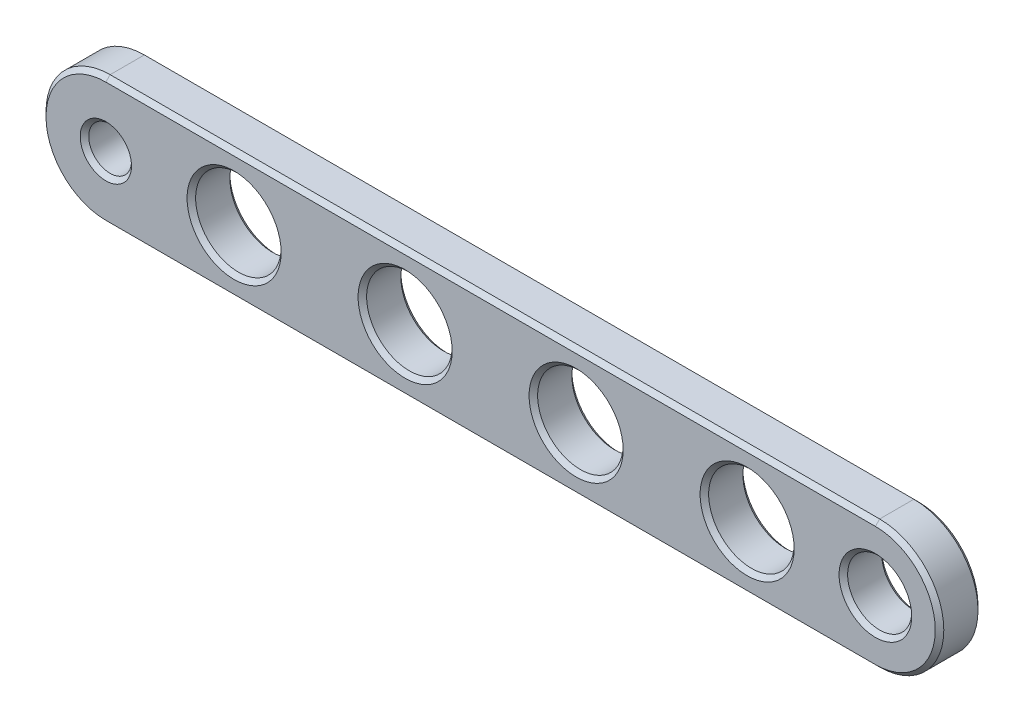
ISO-10303-21;
HEADER;
FILE_DESCRIPTION(('STEP AP214'),'2;1');
FILE_NAME('part.step','',(''),(''),'','','');
FILE_SCHEMA(('AUTOMOTIVE_DESIGN { 1 0 10303 214 1 1 1 1 }'));
ENDSEC;
DATA;
#1=APPLICATION_CONTEXT('core data for automotive mechanical design processes');
#2=APPLICATION_PROTOCOL_DEFINITION('international standard','automotive_design',2000,#1);
#3=PRODUCT_CONTEXT('',#1,'mechanical');
#4=PRODUCT('Part','Part','',(#3));
#5=PRODUCT_RELATED_PRODUCT_CATEGORY('part','',(#4));
#6=PRODUCT_DEFINITION_FORMATION('','',#4);
#7=PRODUCT_DEFINITION_CONTEXT('part definition',#1,'design');
#8=PRODUCT_DEFINITION('design','',#6,#7);
#9=PRODUCT_DEFINITION_SHAPE('','',#8);
#10=(LENGTH_UNIT() NAMED_UNIT(*) SI_UNIT(.MILLI.,.METRE.));
#11=(NAMED_UNIT(*) PLANE_ANGLE_UNIT() SI_UNIT($,.RADIAN.));
#12=(NAMED_UNIT(*) SI_UNIT($,.STERADIAN.) SOLID_ANGLE_UNIT());
#13=UNCERTAINTY_MEASURE_WITH_UNIT(LENGTH_MEASURE(1.E-05),#10,'distance_accuracy_value','');
#14=(GEOMETRIC_REPRESENTATION_CONTEXT(3) GLOBAL_UNCERTAINTY_ASSIGNED_CONTEXT((#13)) GLOBAL_UNIT_ASSIGNED_CONTEXT((#10,
#11,#12)) REPRESENTATION_CONTEXT('',''));
#15=CARTESIAN_POINT('',(0.,0.,0.));
#16=DIRECTION('',(0.,0.,1.));
#17=DIRECTION('',(1.,0.,0.));
#18=AXIS2_PLACEMENT_3D('',#15,#16,#17);
#19=CARTESIAN_POINT('',(-18.,0.,2.));
#20=DIRECTION('',(0.,0.,1.));
#21=DIRECTION('',(1.,0.,0.));
#22=AXIS2_PLACEMENT_3D('',#19,#20,#21);
#23=PLANE('',#22);
#24=CARTESIAN_POINT('',(12.,0.,2.));
#25=DIRECTION('',(0.,0.,1.));
#26=DIRECTION('',(1.,0.,0.));
#27=AXIS2_PLACEMENT_3D('',#24,#25,#26);
#28=CIRCLE('',#27,2.19999999999999);
#29=CARTESIAN_POINT('',(14.2,0.,2.));
#30=VERTEX_POINT('',#29);
#31=EDGE_CURVE('E11',#30,#30,#28,.F.);
#32=ORIENTED_EDGE('',*,*,#31,.T.);
#33=EDGE_LOOP('',(#32));
#34=FACE_BOUND('',#33,.T.);
#35=CARTESIAN_POINT('',(-4.,0.,2.));
#36=DIRECTION('',(0.,0.,1.));
#37=DIRECTION('',(1.,0.,0.));
#38=AXIS2_PLACEMENT_3D('',#35,#36,#37);
#39=CIRCLE('',#38,2.19999999999999);
#40=CARTESIAN_POINT('',(-1.8,0.,2.));
#41=VERTEX_POINT('',#40);
#42=EDGE_CURVE('E45',#41,#41,#39,.F.);
#43=ORIENTED_EDGE('',*,*,#42,.T.);
#44=EDGE_LOOP('',(#43));
#45=FACE_BOUND('',#44,.T.);
#46=CARTESIAN_POINT('',(18.,0.,2.));
#47=DIRECTION('',(0.,0.,1.));
#48=DIRECTION('',(1.,0.,0.));
#49=AXIS2_PLACEMENT_3D('',#46,#47,#48);
#50=CIRCLE('',#49,1.69999999999999);
#51=CARTESIAN_POINT('',(19.7,0.,2.));
#52=VERTEX_POINT('',#51);
#53=EDGE_CURVE('E219',#52,#52,#50,.F.);
#54=ORIENTED_EDGE('',*,*,#53,.T.);
#55=EDGE_LOOP('',(#54));
#56=FACE_BOUND('',#55,.T.);
#57=CARTESIAN_POINT('',(18.,0.,2.));
#58=DIRECTION('',(0.,0.,1.));
#59=DIRECTION('',(1.,0.,0.));
#60=AXIS2_PLACEMENT_3D('',#57,#58,#59);
#61=CIRCLE('',#60,2.8);
#62=CARTESIAN_POINT('',(18.,-2.8,2.));
#63=VERTEX_POINT('',#62);
#64=CARTESIAN_POINT('',(18.,2.8,2.));
#65=VERTEX_POINT('',#64);
#66=EDGE_CURVE('E53',#63,#65,#61,.T.);
#67=ORIENTED_EDGE('',*,*,#66,.T.);
#68=DIRECTION('',(-1.,0.,0.));
#69=VECTOR('',#68,1.);
#70=CARTESIAN_POINT('',(-18.,2.8,2.));
#71=LINE('',#70,#69);
#72=CARTESIAN_POINT('',(-18.,2.8,2.));
#73=VERTEX_POINT('',#72);
#74=EDGE_CURVE('E217',#65,#73,#71,.T.);
#75=ORIENTED_EDGE('',*,*,#74,.T.);
#76=CARTESIAN_POINT('',(-18.,0.,2.));
#77=DIRECTION('',(0.,0.,1.));
#78=DIRECTION('',(1.,0.,0.));
#79=AXIS2_PLACEMENT_3D('',#76,#77,#78);
#80=CIRCLE('',#79,2.8);
#81=CARTESIAN_POINT('',(-18.,-2.8,2.));
#82=VERTEX_POINT('',#81);
#83=EDGE_CURVE('E213',#73,#82,#80,.T.);
#84=ORIENTED_EDGE('',*,*,#83,.T.);
#85=DIRECTION('',(1.,0.,0.));
#86=VECTOR('',#85,1.);
#87=CARTESIAN_POINT('',(18.,-2.8,2.));
#88=LINE('',#87,#86);
#89=EDGE_CURVE('E58',#82,#63,#88,.T.);
#90=ORIENTED_EDGE('',*,*,#89,.T.);
#91=EDGE_LOOP('',(#67,#75,#84,#90));
#92=FACE_BOUND('',#91,.T.);
#93=CARTESIAN_POINT('',(-18.,0.,2.));
#94=DIRECTION('',(0.,0.,1.));
#95=DIRECTION('',(1.,0.,0.));
#96=AXIS2_PLACEMENT_3D('',#93,#94,#95);
#97=CIRCLE('',#96,1.2);
#98=CARTESIAN_POINT('',(-16.8,0.,2.));
#99=VERTEX_POINT('',#98);
#100=EDGE_CURVE('E210',#99,#99,#97,.F.);
#101=ORIENTED_EDGE('',*,*,#100,.T.);
#102=EDGE_LOOP('',(#101));
#103=FACE_BOUND('',#102,.T.);
#104=CARTESIAN_POINT('',(-12.,0.,2.));
#105=DIRECTION('',(0.,0.,1.));
#106=DIRECTION('',(1.,0.,0.));
#107=AXIS2_PLACEMENT_3D('',#104,#105,#106);
#108=CIRCLE('',#107,2.19999999999999);
#109=CARTESIAN_POINT('',(-9.8,0.,2.));
#110=VERTEX_POINT('',#109);
#111=EDGE_CURVE('E207',#110,#110,#108,.F.);
#112=ORIENTED_EDGE('',*,*,#111,.T.);
#113=EDGE_LOOP('',(#112));
#114=FACE_BOUND('',#113,.T.);
#115=CARTESIAN_POINT('',(4.,0.,2.));
#116=DIRECTION('',(0.,0.,1.));
#117=DIRECTION('',(1.,0.,0.));
#118=AXIS2_PLACEMENT_3D('',#115,#116,#117);
#119=CIRCLE('',#118,2.19999999999999);
#120=CARTESIAN_POINT('',(6.2,0.,2.));
#121=VERTEX_POINT('',#120);
#122=EDGE_CURVE('E204',#121,#121,#119,.F.);
#123=ORIENTED_EDGE('',*,*,#122,.T.);
#124=EDGE_LOOP('',(#123));
#125=FACE_BOUND('',#124,.T.);
#126=ADVANCED_FACE('F35',(#34,#45,#56,#92,#103,#114,#125),#23,.T.);
#127=CARTESIAN_POINT('',(-18.,0.,0.));
#128=DIRECTION('',(0.,0.,1.));
#129=DIRECTION('',(1.,0.,0.));
#130=AXIS2_PLACEMENT_3D('',#127,#128,#129);
#131=PLANE('',#130);
#132=CARTESIAN_POINT('',(12.,0.,0.));
#133=DIRECTION('',(0.,0.,1.));
#134=DIRECTION('',(1.,0.,0.));
#135=AXIS2_PLACEMENT_3D('',#132,#133,#134);
#136=CIRCLE('',#135,2.2);
#137=CARTESIAN_POINT('',(14.2,0.,0.));
#138=VERTEX_POINT('',#137);
#139=EDGE_CURVE('E149',#138,#138,#136,.T.);
#140=ORIENTED_EDGE('',*,*,#139,.T.);
#141=EDGE_LOOP('',(#140));
#142=FACE_BOUND('',#141,.T.);
#143=CARTESIAN_POINT('',(4.,0.,0.));
#144=DIRECTION('',(0.,0.,1.));
#145=DIRECTION('',(1.,0.,0.));
#146=AXIS2_PLACEMENT_3D('',#143,#144,#145);
#147=CIRCLE('',#146,2.2);
#148=CARTESIAN_POINT('',(6.2,0.,0.));
#149=VERTEX_POINT('',#148);
#150=EDGE_CURVE('E146',#149,#149,#147,.T.);
#151=ORIENTED_EDGE('',*,*,#150,.T.);
#152=EDGE_LOOP('',(#151));
#153=FACE_BOUND('',#152,.T.);
#154=CARTESIAN_POINT('',(-4.,0.,0.));
#155=DIRECTION('',(0.,0.,1.));
#156=DIRECTION('',(1.,0.,0.));
#157=AXIS2_PLACEMENT_3D('',#154,#155,#156);
#158=CIRCLE('',#157,2.2);
#159=CARTESIAN_POINT('',(-1.8,0.,0.));
#160=VERTEX_POINT('',#159);
#161=EDGE_CURVE('E143',#160,#160,#158,.T.);
#162=ORIENTED_EDGE('',*,*,#161,.T.);
#163=EDGE_LOOP('',(#162));
#164=FACE_BOUND('',#163,.T.);
#165=CARTESIAN_POINT('',(-12.,0.,0.));
#166=DIRECTION('',(0.,0.,1.));
#167=DIRECTION('',(1.,0.,0.));
#168=AXIS2_PLACEMENT_3D('',#165,#166,#167);
#169=CIRCLE('',#168,2.2);
#170=CARTESIAN_POINT('',(-9.79999999999999,0.,0.));
#171=VERTEX_POINT('',#170);
#172=EDGE_CURVE('E140',#171,#171,#169,.T.);
#173=ORIENTED_EDGE('',*,*,#172,.T.);
#174=EDGE_LOOP('',(#173));
#175=FACE_BOUND('',#174,.T.);
#176=CARTESIAN_POINT('',(18.,0.,0.));
#177=DIRECTION('',(0.,0.,1.));
#178=DIRECTION('',(1.,0.,0.));
#179=AXIS2_PLACEMENT_3D('',#176,#177,#178);
#180=CIRCLE('',#179,1.7);
#181=CARTESIAN_POINT('',(16.3,0.,0.));
#182=VERTEX_POINT('',#181);
#183=EDGE_CURVE('E133',#182,#182,#180,.T.);
#184=ORIENTED_EDGE('',*,*,#183,.T.);
#185=EDGE_LOOP('',(#184));
#186=FACE_BOUND('',#185,.T.);
#187=CARTESIAN_POINT('',(-18.,0.,0.));
#188=DIRECTION('',(0.,0.,1.));
#189=DIRECTION('',(1.,0.,0.));
#190=AXIS2_PLACEMENT_3D('',#187,#188,#189);
#191=CIRCLE('',#190,1.2);
#192=CARTESIAN_POINT('',(-16.8,0.,0.));
#193=VERTEX_POINT('',#192);
#194=EDGE_CURVE('E130',#193,#193,#191,.T.);
#195=ORIENTED_EDGE('',*,*,#194,.T.);
#196=EDGE_LOOP('',(#195));
#197=FACE_BOUND('',#196,.T.);
#198=CARTESIAN_POINT('',(18.,0.,0.));
#199=DIRECTION('',(0.,0.,1.));
#200=DIRECTION('',(1.,0.,0.));
#201=AXIS2_PLACEMENT_3D('',#198,#199,#200);
#202=CIRCLE('',#201,2.8);
#203=CARTESIAN_POINT('',(18.,2.8,0.));
#204=VERTEX_POINT('',#203);
#205=CARTESIAN_POINT('',(18.,-2.8,0.));
#206=VERTEX_POINT('',#205);
#207=EDGE_CURVE('E129',#204,#206,#202,.F.);
#208=ORIENTED_EDGE('',*,*,#207,.T.);
#209=DIRECTION('',(-1.,0.,0.));
#210=VECTOR('',#209,1.);
#211=CARTESIAN_POINT('',(-18.,-2.8,0.));
#212=LINE('',#211,#210);
#213=CARTESIAN_POINT('',(-18.,-2.8,0.));
#214=VERTEX_POINT('',#213);
#215=EDGE_CURVE('E108',#206,#214,#212,.T.);
#216=ORIENTED_EDGE('',*,*,#215,.T.);
#217=CARTESIAN_POINT('',(-18.,0.,0.));
#218=DIRECTION('',(0.,0.,1.));
#219=DIRECTION('',(1.,0.,0.));
#220=AXIS2_PLACEMENT_3D('',#217,#218,#219);
#221=CIRCLE('',#220,2.8);
#222=CARTESIAN_POINT('',(-18.,2.8,0.));
#223=VERTEX_POINT('',#222);
#224=EDGE_CURVE('E118',#214,#223,#221,.F.);
#225=ORIENTED_EDGE('',*,*,#224,.T.);
#226=DIRECTION('',(1.,0.,0.));
#227=VECTOR('',#226,1.);
#228=CARTESIAN_POINT('',(-18.,2.8,0.));
#229=LINE('',#228,#227);
#230=EDGE_CURVE('E124',#223,#204,#229,.T.);
#231=ORIENTED_EDGE('',*,*,#230,.T.);
#232=EDGE_LOOP('',(#208,#216,#225,#231));
#233=FACE_BOUND('',#232,.T.);
#234=ADVANCED_FACE('F127',(#142,#153,#164,#175,#186,#197,#233),#131,.F.);
#235=CARTESIAN_POINT('',(-18.,0.,2.));
#236=DIRECTION('',(0.,0.,-1.));
#237=DIRECTION('',(-1.,0.,0.));
#238=AXIS2_PLACEMENT_3D('',#235,#236,#237);
#239=CYLINDRICAL_SURFACE('',#238,3.);
#240=DIRECTION('',(0.,0.,-1.));
#241=VECTOR('',#240,1.);
#242=CARTESIAN_POINT('',(-18.,3.,2.));
#243=LINE('',#242,#241);
#244=CARTESIAN_POINT('',(-18.,3.,1.80000000000001));
#245=VERTEX_POINT('',#244);
#246=CARTESIAN_POINT('',(-18.,3.,0.199999999999997));
#247=VERTEX_POINT('',#246);
#248=EDGE_CURVE('E228',#245,#247,#243,.T.);
#249=ORIENTED_EDGE('',*,*,#248,.T.);
#250=CARTESIAN_POINT('',(-18.,0.,0.199999999999997));
#251=DIRECTION('',(0.,0.,1.));
#252=DIRECTION('',(1.,0.,0.));
#253=AXIS2_PLACEMENT_3D('',#250,#251,#252);
#254=CIRCLE('',#253,3.);
#255=CARTESIAN_POINT('',(-18.,-3.,0.199999999999997));
#256=VERTEX_POINT('',#255);
#257=EDGE_CURVE('E202',#247,#256,#254,.T.);
#258=ORIENTED_EDGE('',*,*,#257,.T.);
#259=DIRECTION('',(0.,0.,-1.));
#260=VECTOR('',#259,1.);
#261=CARTESIAN_POINT('',(-18.,-3.,2.));
#262=LINE('',#261,#260);
#263=CARTESIAN_POINT('',(-18.,-3.,1.80000000000001));
#264=VERTEX_POINT('',#263);
#265=EDGE_CURVE('E125',#264,#256,#262,.T.);
#266=ORIENTED_EDGE('',*,*,#265,.F.);
#267=CARTESIAN_POINT('',(-18.,0.,1.80000000000001));
#268=DIRECTION('',(0.,0.,1.));
#269=DIRECTION('',(1.,0.,0.));
#270=AXIS2_PLACEMENT_3D('',#267,#268,#269);
#271=CIRCLE('',#270,3.);
#272=EDGE_CURVE('E200',#264,#245,#271,.F.);
#273=ORIENTED_EDGE('',*,*,#272,.T.);
#274=EDGE_LOOP('',(#249,#258,#266,#273));
#275=FACE_BOUND('',#274,.T.);
#276=ADVANCED_FACE('F254',(#275),#239,.T.);
#277=CARTESIAN_POINT('',(-18.,-3.,2.));
#278=DIRECTION('',(0.,1.,0.));
#279=DIRECTION('',(0.,0.,1.));
#280=AXIS2_PLACEMENT_3D('',#277,#278,#279);
#281=PLANE('',#280);
#282=ORIENTED_EDGE('',*,*,#265,.T.);
#283=DIRECTION('',(1.,0.,0.));
#284=VECTOR('',#283,1.);
#285=CARTESIAN_POINT('',(-18.,-3.,0.199999999999997));
#286=LINE('',#285,#284);
#287=CARTESIAN_POINT('',(18.,-3.,0.199999999999997));
#288=VERTEX_POINT('',#287);
#289=EDGE_CURVE('E111',#256,#288,#286,.T.);
#290=ORIENTED_EDGE('',*,*,#289,.T.);
#291=DIRECTION('',(0.,0.,-1.));
#292=VECTOR('',#291,1.);
#293=CARTESIAN_POINT('',(18.,-3.,2.));
#294=LINE('',#293,#292);
#295=CARTESIAN_POINT('',(18.,-3.,1.80000000000001));
#296=VERTEX_POINT('',#295);
#297=EDGE_CURVE('E251',#296,#288,#294,.T.);
#298=ORIENTED_EDGE('',*,*,#297,.F.);
#299=DIRECTION('',(-1.,0.,0.));
#300=VECTOR('',#299,1.);
#301=CARTESIAN_POINT('',(-18.,-3.,1.80000000000001));
#302=LINE('',#301,#300);
#303=EDGE_CURVE('E188',#296,#264,#302,.T.);
#304=ORIENTED_EDGE('',*,*,#303,.T.);
#305=EDGE_LOOP('',(#282,#290,#298,#304));
#306=FACE_BOUND('',#305,.T.);
#307=ADVANCED_FACE('F249',(#306),#281,.F.);
#308=CARTESIAN_POINT('',(18.,0.,2.));
#309=DIRECTION('',(0.,0.,-1.));
#310=DIRECTION('',(-1.,0.,0.));
#311=AXIS2_PLACEMENT_3D('',#308,#309,#310);
#312=CYLINDRICAL_SURFACE('',#311,3.);
#313=ORIENTED_EDGE('',*,*,#297,.T.);
#314=CARTESIAN_POINT('',(18.,0.,0.199999999999997));
#315=DIRECTION('',(0.,0.,1.));
#316=DIRECTION('',(1.,0.,0.));
#317=AXIS2_PLACEMENT_3D('',#314,#315,#316);
#318=CIRCLE('',#317,3.);
#319=CARTESIAN_POINT('',(18.,3.,0.199999999999997));
#320=VERTEX_POINT('',#319);
#321=EDGE_CURVE('E193',#288,#320,#318,.T.);
#322=ORIENTED_EDGE('',*,*,#321,.T.);
#323=DIRECTION('',(0.,0.,-1.));
#324=VECTOR('',#323,1.);
#325=CARTESIAN_POINT('',(18.,3.,2.));
#326=LINE('',#325,#324);
#327=CARTESIAN_POINT('',(18.,3.,1.80000000000001));
#328=VERTEX_POINT('',#327);
#329=EDGE_CURVE('E257',#328,#320,#326,.T.);
#330=ORIENTED_EDGE('',*,*,#329,.F.);
#331=CARTESIAN_POINT('',(18.,0.,1.80000000000001));
#332=DIRECTION('',(0.,0.,1.));
#333=DIRECTION('',(1.,0.,0.));
#334=AXIS2_PLACEMENT_3D('',#331,#332,#333);
#335=CIRCLE('',#334,3.);
#336=EDGE_CURVE('E191',#328,#296,#335,.F.);
#337=ORIENTED_EDGE('',*,*,#336,.T.);
#338=EDGE_LOOP('',(#313,#322,#330,#337));
#339=FACE_BOUND('',#338,.T.);
#340=ADVANCED_FACE('F270',(#339),#312,.T.);
#341=CARTESIAN_POINT('',(-18.,3.,2.));
#342=DIRECTION('',(0.,-1.,0.));
#343=DIRECTION('',(0.,0.,-1.));
#344=AXIS2_PLACEMENT_3D('',#341,#342,#343);
#345=PLANE('',#344);
#346=ORIENTED_EDGE('',*,*,#329,.T.);
#347=DIRECTION('',(-1.,0.,0.));
#348=VECTOR('',#347,1.);
#349=CARTESIAN_POINT('',(-18.,3.,0.199999999999997));
#350=LINE('',#349,#348);
#351=EDGE_CURVE('E198',#320,#247,#350,.T.);
#352=ORIENTED_EDGE('',*,*,#351,.T.);
#353=ORIENTED_EDGE('',*,*,#248,.F.);
#354=DIRECTION('',(1.,0.,0.));
#355=VECTOR('',#354,1.);
#356=CARTESIAN_POINT('',(18.,3.,1.80000000000001));
#357=LINE('',#356,#355);
#358=EDGE_CURVE('E195',#245,#328,#357,.T.);
#359=ORIENTED_EDGE('',*,*,#358,.T.);
#360=EDGE_LOOP('',(#346,#352,#353,#359));
#361=FACE_BOUND('',#360,.T.);
#362=ADVANCED_FACE('F274',(#361),#345,.F.);
#363=CARTESIAN_POINT('',(-18.,0.,2.));
#364=DIRECTION('',(0.,0.,-1.));
#365=DIRECTION('',(-1.,0.,0.));
#366=AXIS2_PLACEMENT_3D('',#363,#364,#365);
#367=CYLINDRICAL_SURFACE('',#366,1.);
#368=CARTESIAN_POINT('',(-18.,0.,0.199999999999995));
#369=DIRECTION('',(0.,0.,1.));
#370=DIRECTION('',(1.,0.,0.));
#371=AXIS2_PLACEMENT_3D('',#368,#369,#370);
#372=CIRCLE('',#371,1.);
#373=CARTESIAN_POINT('',(-17.,0.,0.199999999999995));
#374=VERTEX_POINT('',#373);
#375=EDGE_CURVE('E185',#374,#374,#372,.F.);
#376=ORIENTED_EDGE('',*,*,#375,.T.);
#377=EDGE_LOOP('',(#376));
#378=FACE_BOUND('',#377,.T.);
#379=CARTESIAN_POINT('',(-18.,0.,1.8));
#380=DIRECTION('',(0.,0.,1.));
#381=DIRECTION('',(1.,0.,0.));
#382=AXIS2_PLACEMENT_3D('',#379,#380,#381);
#383=CIRCLE('',#382,1.);
#384=CARTESIAN_POINT('',(-17.,0.,1.8));
#385=VERTEX_POINT('',#384);
#386=EDGE_CURVE('E182',#385,#385,#383,.T.);
#387=ORIENTED_EDGE('',*,*,#386,.T.);
#388=EDGE_LOOP('',(#387));
#389=FACE_BOUND('',#388,.T.);
#390=ADVANCED_FACE('F318',(#378,#389),#367,.F.);
#391=CARTESIAN_POINT('',(18.,0.,2.));
#392=DIRECTION('',(0.,0.,-1.));
#393=DIRECTION('',(-1.,0.,0.));
#394=AXIS2_PLACEMENT_3D('',#391,#392,#393);
#395=CYLINDRICAL_SURFACE('',#394,1.5);
#396=CARTESIAN_POINT('',(18.,0.,0.199999999999994));
#397=DIRECTION('',(0.,0.,1.));
#398=DIRECTION('',(1.,0.,0.));
#399=AXIS2_PLACEMENT_3D('',#396,#397,#398);
#400=CIRCLE('',#399,1.5);
#401=CARTESIAN_POINT('',(16.5,0.,0.199999999999994));
#402=VERTEX_POINT('',#401);
#403=EDGE_CURVE('E179',#402,#402,#400,.F.);
#404=CARTESIAN_POINT('',(18.,0.,1.80000000000001));
#405=DIRECTION('',(0.,0.,1.));
#406=DIRECTION('',(1.,0.,0.));
#407=AXIS2_PLACEMENT_3D('',#404,#405,#406);
#408=CIRCLE('',#407,1.5);
#409=CARTESIAN_POINT('',(16.5,0.,1.80000000000001));
#410=VERTEX_POINT('',#409);
#411=EDGE_CURVE('E176',#410,#410,#408,.T.);
#412=CARTESIAN_POINT('',(16.5,0.,0.199999999999994));
#413=CARTESIAN_POINT('',(16.5,0.,0.216666666666661));
#414=CARTESIAN_POINT('',(16.5,0.,0.233333333333328));
#415=CARTESIAN_POINT('',(16.5,0.,0.266666666666661));
#416=CARTESIAN_POINT('',(16.5,0.,0.283333333333328));
#417=CARTESIAN_POINT('',(16.5,0.,0.316666666666662));
#418=CARTESIAN_POINT('',(16.5,0.,0.333333333333328));
#419=CARTESIAN_POINT('',(16.5,0.,0.366666666666662));
#420=CARTESIAN_POINT('',(16.5,0.,0.383333333333329));
#421=CARTESIAN_POINT('',(16.5,0.,0.416666666666662));
#422=CARTESIAN_POINT('',(16.5,0.,0.433333333333329));
#423=CARTESIAN_POINT('',(16.5,0.,0.466666666666663));
#424=CARTESIAN_POINT('',(16.5,0.,0.48333333333333));
#425=CARTESIAN_POINT('',(16.5,0.,0.516666666666663));
#426=CARTESIAN_POINT('',(16.5,0.,0.53333333333333));
#427=CARTESIAN_POINT('',(16.5,0.,0.566666666666664));
#428=CARTESIAN_POINT('',(16.5,0.,0.58333333333333));
#429=CARTESIAN_POINT('',(16.5,0.,0.616666666666664));
#430=CARTESIAN_POINT('',(16.5,0.,0.633333333333331));
#431=CARTESIAN_POINT('',(16.5,0.,0.666666666666664));
#432=CARTESIAN_POINT('',(16.5,0.,0.683333333333331));
#433=CARTESIAN_POINT('',(16.5,0.,0.716666666666665));
#434=CARTESIAN_POINT('',(16.5,0.,0.733333333333332));
#435=CARTESIAN_POINT('',(16.5,0.,0.766666666666665));
#436=CARTESIAN_POINT('',(16.5,0.,0.783333333333332));
#437=CARTESIAN_POINT('',(16.5,0.,0.816666666666666));
#438=CARTESIAN_POINT('',(16.5,0.,0.833333333333332));
#439=CARTESIAN_POINT('',(16.5,0.,0.866666666666666));
#440=CARTESIAN_POINT('',(16.5,0.,0.883333333333333));
#441=CARTESIAN_POINT('',(16.5,0.,0.916666666666666));
#442=CARTESIAN_POINT('',(16.5,0.,0.933333333333333));
#443=CARTESIAN_POINT('',(16.5,0.,0.966666666666667));
#444=CARTESIAN_POINT('',(16.5,0.,0.983333333333334));
#445=CARTESIAN_POINT('',(16.5,0.,1.01666666666667));
#446=CARTESIAN_POINT('',(16.5,0.,1.03333333333333));
#447=CARTESIAN_POINT('',(16.5,0.,1.06666666666667));
#448=CARTESIAN_POINT('',(16.5,0.,1.08333333333333));
#449=CARTESIAN_POINT('',(16.5,0.,1.11666666666667));
#450=CARTESIAN_POINT('',(16.5,0.,1.13333333333333));
#451=CARTESIAN_POINT('',(16.5,0.,1.16666666666667));
#452=CARTESIAN_POINT('',(16.5,0.,1.18333333333334));
#453=CARTESIAN_POINT('',(16.5,0.,1.21666666666667));
#454=CARTESIAN_POINT('',(16.5,0.,1.23333333333334));
#455=CARTESIAN_POINT('',(16.5,0.,1.26666666666667));
#456=CARTESIAN_POINT('',(16.5,0.,1.28333333333334));
#457=CARTESIAN_POINT('',(16.5,0.,1.31666666666667));
#458=CARTESIAN_POINT('',(16.5,0.,1.33333333333334));
#459=CARTESIAN_POINT('',(16.5,0.,1.36666666666667));
#460=CARTESIAN_POINT('',(16.5,0.,1.38333333333334));
#461=CARTESIAN_POINT('',(16.5,0.,1.41666666666667));
#462=CARTESIAN_POINT('',(16.5,0.,1.43333333333334));
#463=CARTESIAN_POINT('',(16.5,0.,1.46666666666667));
#464=CARTESIAN_POINT('',(16.5,0.,1.48333333333334));
#465=CARTESIAN_POINT('',(16.5,0.,1.51666666666667));
#466=CARTESIAN_POINT('',(16.5,0.,1.53333333333334));
#467=CARTESIAN_POINT('',(16.5,0.,1.56666666666667));
#468=CARTESIAN_POINT('',(16.5,0.,1.58333333333334));
#469=CARTESIAN_POINT('',(16.5,0.,1.61666666666667));
#470=CARTESIAN_POINT('',(16.5,0.,1.63333333333334));
#471=CARTESIAN_POINT('',(16.5,0.,1.66666666666667));
#472=CARTESIAN_POINT('',(16.5,0.,1.68333333333334));
#473=CARTESIAN_POINT('',(16.5,0.,1.71666666666667));
#474=CARTESIAN_POINT('',(16.5,0.,1.73333333333334));
#475=CARTESIAN_POINT('',(16.5,0.,1.76666666666667));
#476=CARTESIAN_POINT('',(16.5,0.,1.78333333333334));
#477=CARTESIAN_POINT('',(16.5,0.,1.80000000000001));
#478=B_SPLINE_CURVE_WITH_KNOTS('',3,(#412,#413,#414,#415,#416,#417,#418,#419,#420,#421,#422,
#423,#424,#425,#426,#427,#428,#429,#430,#431,#432,#433,#434,#435,#436,#437,#438,#439,#440,#441,
#442,#443,#444,#445,#446,#447,#448,#449,#450,#451,#452,#453,#454,#455,#456,#457,#458,#459,#460,
#461,#462,#463,#464,#465,#466,#467,#468,#469,#470,#471,#472,#473,#474,#475,#476,#477),
.UNSPECIFIED.,.F.,.F.,(4,2,2,2,2,2,2,2,2,2,2,2,2,2,2,2,2,2,2,2,2,2,2,2,2,2,2,2,2,2,2,2,4),(0.,
0.0500000000000003,0.100000000000001,0.150000000000001,0.200000000000002,0.250000000000002,
0.300000000000002,0.350000000000003,0.400000000000003,0.450000000000004,0.500000000000004,
0.550000000000004,0.600000000000005,0.650000000000005,0.700000000000005,0.750000000000006,
0.800000000000006,0.850000000000007,0.900000000000007,0.950000000000007,1.00000000000001,
1.05000000000001,1.10000000000001,1.15000000000001,1.20000000000001,1.25000000000001,
1.30000000000001,1.35000000000001,1.40000000000001,1.45000000000001,1.50000000000001,
1.55000000000001,1.60000000000001),.UNSPECIFIED.);
#479=EDGE_CURVE('BSEAM314',#402,#410,#478,.T.);
#480=ORIENTED_EDGE('',*,*,#403,.T.);
#481=ORIENTED_EDGE('',*,*,#411,.T.);
#482=ORIENTED_EDGE('',*,*,#479,.T.);
#483=ORIENTED_EDGE('',*,*,#479,.F.);
#484=EDGE_LOOP('',(#480,#482,#481,#483));
#485=FACE_BOUND('',#484,.T.);
#486=ADVANCED_FACE('F314',(#485),#395,.F.);
#487=CARTESIAN_POINT('',(-12.,0.,2.));
#488=DIRECTION('',(0.,0.,-1.));
#489=DIRECTION('',(-1.,0.,0.));
#490=AXIS2_PLACEMENT_3D('',#487,#488,#489);
#491=CYLINDRICAL_SURFACE('',#490,2.);
#492=CARTESIAN_POINT('',(-12.,0.,0.200000000000001));
#493=DIRECTION('',(0.,0.,1.));
#494=DIRECTION('',(1.,0.,0.));
#495=AXIS2_PLACEMENT_3D('',#492,#493,#494);
#496=CIRCLE('',#495,2.);
#497=CARTESIAN_POINT('',(-10.,0.,0.200000000000001));
#498=VERTEX_POINT('',#497);
#499=EDGE_CURVE('E173',#498,#498,#496,.F.);
#500=ORIENTED_EDGE('',*,*,#499,.T.);
#501=EDGE_LOOP('',(#500));
#502=FACE_BOUND('',#501,.T.);
#503=CARTESIAN_POINT('',(-12.,0.,1.80000000000001));
#504=DIRECTION('',(0.,0.,1.));
#505=DIRECTION('',(1.,0.,0.));
#506=AXIS2_PLACEMENT_3D('',#503,#504,#505);
#507=CIRCLE('',#506,2.);
#508=CARTESIAN_POINT('',(-10.,0.,1.80000000000001));
#509=VERTEX_POINT('',#508);
#510=EDGE_CURVE('E170',#509,#509,#507,.T.);
#511=ORIENTED_EDGE('',*,*,#510,.T.);
#512=EDGE_LOOP('',(#511));
#513=FACE_BOUND('',#512,.T.);
#514=ADVANCED_FACE('F308',(#502,#513),#491,.F.);
#515=CARTESIAN_POINT('',(-4.,0.,2.));
#516=DIRECTION('',(0.,0.,-1.));
#517=DIRECTION('',(-1.,0.,0.));
#518=AXIS2_PLACEMENT_3D('',#515,#516,#517);
#519=CYLINDRICAL_SURFACE('',#518,2.);
#520=CARTESIAN_POINT('',(-4.,0.,0.199999999999997));
#521=DIRECTION('',(0.,0.,1.));
#522=DIRECTION('',(1.,0.,0.));
#523=AXIS2_PLACEMENT_3D('',#520,#521,#522);
#524=CIRCLE('',#523,2.);
#525=CARTESIAN_POINT('',(-2.,0.,0.199999999999997));
#526=VERTEX_POINT('',#525);
#527=EDGE_CURVE('E167',#526,#526,#524,.F.);
#528=ORIENTED_EDGE('',*,*,#527,.T.);
#529=EDGE_LOOP('',(#528));
#530=FACE_BOUND('',#529,.T.);
#531=CARTESIAN_POINT('',(-4.,0.,1.80000000000001));
#532=DIRECTION('',(0.,0.,1.));
#533=DIRECTION('',(1.,0.,0.));
#534=AXIS2_PLACEMENT_3D('',#531,#532,#533);
#535=CIRCLE('',#534,2.);
#536=CARTESIAN_POINT('',(-2.,0.,1.80000000000001));
#537=VERTEX_POINT('',#536);
#538=EDGE_CURVE('E164',#537,#537,#535,.T.);
#539=ORIENTED_EDGE('',*,*,#538,.T.);
#540=EDGE_LOOP('',(#539));
#541=FACE_BOUND('',#540,.T.);
#542=ADVANCED_FACE('F298',(#530,#541),#519,.F.);
#543=CARTESIAN_POINT('',(4.,0.,2.));
#544=DIRECTION('',(0.,0.,-1.));
#545=DIRECTION('',(-1.,0.,0.));
#546=AXIS2_PLACEMENT_3D('',#543,#544,#545);
#547=CYLINDRICAL_SURFACE('',#546,2.);
#548=CARTESIAN_POINT('',(4.,0.,0.199999999999997));
#549=DIRECTION('',(0.,0.,1.));
#550=DIRECTION('',(1.,0.,0.));
#551=AXIS2_PLACEMENT_3D('',#548,#549,#550);
#552=CIRCLE('',#551,2.);
#553=CARTESIAN_POINT('',(6.,0.,0.199999999999997));
#554=VERTEX_POINT('',#553);
#555=EDGE_CURVE('E161',#554,#554,#552,.F.);
#556=ORIENTED_EDGE('',*,*,#555,.T.);
#557=EDGE_LOOP('',(#556));
#558=FACE_BOUND('',#557,.T.);
#559=CARTESIAN_POINT('',(4.,0.,1.80000000000001));
#560=DIRECTION('',(0.,0.,1.));
#561=DIRECTION('',(1.,0.,0.));
#562=AXIS2_PLACEMENT_3D('',#559,#560,#561);
#563=CIRCLE('',#562,2.);
#564=CARTESIAN_POINT('',(6.,0.,1.80000000000001));
#565=VERTEX_POINT('',#564);
#566=EDGE_CURVE('E158',#565,#565,#563,.T.);
#567=ORIENTED_EDGE('',*,*,#566,.T.);
#568=EDGE_LOOP('',(#567));
#569=FACE_BOUND('',#568,.T.);
#570=ADVANCED_FACE('F295',(#558,#569),#547,.F.);
#571=CARTESIAN_POINT('',(12.,0.,2.));
#572=DIRECTION('',(0.,0.,-1.));
#573=DIRECTION('',(-1.,0.,0.));
#574=AXIS2_PLACEMENT_3D('',#571,#572,#573);
#575=CYLINDRICAL_SURFACE('',#574,2.);
#576=CARTESIAN_POINT('',(12.,0.,0.200000000000001));
#577=DIRECTION('',(0.,0.,1.));
#578=DIRECTION('',(1.,0.,0.));
#579=AXIS2_PLACEMENT_3D('',#576,#577,#578);
#580=CIRCLE('',#579,2.);
#581=CARTESIAN_POINT('',(14.,0.,0.200000000000001));
#582=VERTEX_POINT('',#581);
#583=EDGE_CURVE('E155',#582,#582,#580,.F.);
#584=ORIENTED_EDGE('',*,*,#583,.T.);
#585=EDGE_LOOP('',(#584));
#586=FACE_BOUND('',#585,.T.);
#587=CARTESIAN_POINT('',(12.,0.,1.80000000000001));
#588=DIRECTION('',(0.,0.,1.));
#589=DIRECTION('',(1.,0.,0.));
#590=AXIS2_PLACEMENT_3D('',#587,#588,#589);
#591=CIRCLE('',#590,2.);
#592=CARTESIAN_POINT('',(14.,0.,1.80000000000001));
#593=VERTEX_POINT('',#592);
#594=EDGE_CURVE('E152',#593,#593,#591,.T.);
#595=ORIENTED_EDGE('',*,*,#594,.T.);
#596=EDGE_LOOP('',(#595));
#597=FACE_BOUND('',#596,.T.);
#598=ADVANCED_FACE('F297',(#586,#597),#575,.F.);
#599=CARTESIAN_POINT('',(12.,0.,0.));
#600=DIRECTION('',(0.,0.,-1.));
#601=DIRECTION('',(-1.,0.,0.));
#602=AXIS2_PLACEMENT_3D('',#599,#600,#601);
#603=CONICAL_SURFACE('',#602,2.2,0.785398163397457);
#604=ORIENTED_EDGE('',*,*,#583,.F.);
#605=EDGE_LOOP('',(#604));
#606=FACE_BOUND('',#605,.T.);
#607=ORIENTED_EDGE('',*,*,#139,.F.);
#608=EDGE_LOOP('',(#607));
#609=FACE_BOUND('',#608,.T.);
#610=ADVANCED_FACE('F305',(#606,#609),#603,.F.);
#611=CARTESIAN_POINT('',(4.,0.,0.));
#612=DIRECTION('',(0.,0.,-1.));
#613=DIRECTION('',(-1.,0.,0.));
#614=AXIS2_PLACEMENT_3D('',#611,#612,#613);
#615=CONICAL_SURFACE('',#614,2.2,0.785398163397449);
#616=ORIENTED_EDGE('',*,*,#555,.F.);
#617=EDGE_LOOP('',(#616));
#618=FACE_BOUND('',#617,.T.);
#619=ORIENTED_EDGE('',*,*,#150,.F.);
#620=EDGE_LOOP('',(#619));
#621=FACE_BOUND('',#620,.T.);
#622=ADVANCED_FACE('F340',(#618,#621),#615,.F.);
#623=CARTESIAN_POINT('',(-4.,0.,0.));
#624=DIRECTION('',(0.,0.,-1.));
#625=DIRECTION('',(-1.,0.,0.));
#626=AXIS2_PLACEMENT_3D('',#623,#624,#625);
#627=CONICAL_SURFACE('',#626,2.2,0.785398163397449);
#628=ORIENTED_EDGE('',*,*,#527,.F.);
#629=EDGE_LOOP('',(#628));
#630=FACE_BOUND('',#629,.T.);
#631=ORIENTED_EDGE('',*,*,#161,.F.);
#632=EDGE_LOOP('',(#631));
#633=FACE_BOUND('',#632,.T.);
#634=ADVANCED_FACE('F347',(#630,#633),#627,.F.);
#635=CARTESIAN_POINT('',(-12.,0.,0.));
#636=DIRECTION('',(0.,0.,-1.));
#637=DIRECTION('',(-1.,0.,0.));
#638=AXIS2_PLACEMENT_3D('',#635,#636,#637);
#639=CONICAL_SURFACE('',#638,2.2,0.785398163397457);
#640=ORIENTED_EDGE('',*,*,#499,.F.);
#641=EDGE_LOOP('',(#640));
#642=FACE_BOUND('',#641,.T.);
#643=ORIENTED_EDGE('',*,*,#172,.F.);
#644=EDGE_LOOP('',(#643));
#645=FACE_BOUND('',#644,.T.);
#646=ADVANCED_FACE('F354',(#642,#645),#639,.F.);
#647=CARTESIAN_POINT('',(18.,0.,0.));
#648=DIRECTION('',(0.,0.,-1.));
#649=DIRECTION('',(-1.,0.,0.));
#650=AXIS2_PLACEMENT_3D('',#647,#648,#649);
#651=CONICAL_SURFACE('',#650,1.7,0.785398163397461);
#652=CARTESIAN_POINT('',(16.5,0.,0.199999999999994));
#653=CARTESIAN_POINT('',(16.4979166666667,0.,0.197916666666661));
#654=CARTESIAN_POINT('',(16.4958333333333,0.,0.195833333333328));
#655=CARTESIAN_POINT('',(16.4916666666667,0.,0.191666666666661));
#656=CARTESIAN_POINT('',(16.4895833333333,0.,0.189583333333328));
#657=CARTESIAN_POINT('',(16.4854166666667,0.,0.185416666666661));
#658=CARTESIAN_POINT('',(16.4833333333333,0.,0.183333333333328));
#659=CARTESIAN_POINT('',(16.4791666666667,0.,0.179166666666661));
#660=CARTESIAN_POINT('',(16.4770833333333,0.,0.177083333333328));
#661=CARTESIAN_POINT('',(16.4729166666667,0.,0.172916666666662));
#662=CARTESIAN_POINT('',(16.4708333333333,0.,0.170833333333328));
#663=CARTESIAN_POINT('',(16.4666666666667,0.,0.166666666666662));
#664=CARTESIAN_POINT('',(16.4645833333333,0.,0.164583333333329));
#665=CARTESIAN_POINT('',(16.4604166666667,0.,0.160416666666662));
#666=CARTESIAN_POINT('',(16.4583333333333,0.,0.158333333333329));
#667=CARTESIAN_POINT('',(16.4541666666667,0.,0.154166666666662));
#668=CARTESIAN_POINT('',(16.4520833333333,0.,0.152083333333329));
#669=CARTESIAN_POINT('',(16.4479166666667,0.,0.147916666666662));
#670=CARTESIAN_POINT('',(16.4458333333333,0.,0.145833333333329));
#671=CARTESIAN_POINT('',(16.4416666666667,0.,0.141666666666663));
#672=CARTESIAN_POINT('',(16.4395833333333,0.,0.139583333333329));
#673=CARTESIAN_POINT('',(16.4354166666667,0.,0.135416666666663));
#674=CARTESIAN_POINT('',(16.4333333333333,0.,0.133333333333329));
#675=CARTESIAN_POINT('',(16.4291666666667,0.,0.129166666666663));
#676=CARTESIAN_POINT('',(16.4270833333333,0.,0.12708333333333));
#677=CARTESIAN_POINT('',(16.4229166666667,0.,0.122916666666663));
#678=CARTESIAN_POINT('',(16.4208333333333,0.,0.120833333333329));
#679=CARTESIAN_POINT('',(16.4166666666667,0.,0.116666666666663));
#680=CARTESIAN_POINT('',(16.4145833333333,0.,0.11458333333333));
#681=CARTESIAN_POINT('',(16.4104166666667,0.,0.110416666666664));
#682=CARTESIAN_POINT('',(16.4083333333333,0.,0.10833333333333));
#683=CARTESIAN_POINT('',(16.4041666666667,0.,0.104166666666664));
#684=CARTESIAN_POINT('',(16.4020833333333,0.,0.10208333333333));
#685=CARTESIAN_POINT('',(16.3979166666667,0.,0.0979166666666638));
#686=CARTESIAN_POINT('',(16.3958333333333,0.,0.0958333333333305));
#687=CARTESIAN_POINT('',(16.3916666666667,0.,0.091666666666664));
#688=CARTESIAN_POINT('',(16.3895833333333,0.,0.0895833333333308));
#689=CARTESIAN_POINT('',(16.3854166666667,0.,0.0854166666666641));
#690=CARTESIAN_POINT('',(16.3833333333333,0.,0.0833333333333306));
#691=CARTESIAN_POINT('',(16.3791666666667,0.,0.0791666666666642));
#692=CARTESIAN_POINT('',(16.3770833333333,0.,0.0770833333333313));
#693=CARTESIAN_POINT('',(16.3729166666667,0.,0.0729166666666649));
#694=CARTESIAN_POINT('',(16.3708333333333,0.,0.0708333333333314));
#695=CARTESIAN_POINT('',(16.3666666666667,0.,0.0666666666666646));
#696=CARTESIAN_POINT('',(16.3645833333333,0.,0.0645833333333314));
#697=CARTESIAN_POINT('',(16.3604166666667,0.,0.060416666666665));
#698=CARTESIAN_POINT('',(16.3583333333333,0.,0.0583333333333318));
#699=CARTESIAN_POINT('',(16.3541666666667,0.,0.054166666666665));
#700=CARTESIAN_POINT('',(16.3520833333333,0.,0.0520833333333315));
#701=CARTESIAN_POINT('',(16.3479166666667,0.,0.0479166666666651));
#702=CARTESIAN_POINT('',(16.3458333333333,0.,0.0458333333333322));
#703=CARTESIAN_POINT('',(16.3416666666667,0.,0.0416666666666658));
#704=CARTESIAN_POINT('',(16.3395833333333,0.,0.0395833333333323));
#705=CARTESIAN_POINT('',(16.3354166666667,0.,0.0354166666666655));
#706=CARTESIAN_POINT('',(16.3333333333333,0.,0.0333333333333323));
#707=CARTESIAN_POINT('',(16.3291666666667,0.,0.0291666666666659));
#708=CARTESIAN_POINT('',(16.3270833333333,0.,0.0270833333333327));
#709=CARTESIAN_POINT('',(16.3229166666667,0.,0.0229166666666659));
#710=CARTESIAN_POINT('',(16.3208333333333,0.,0.0208333333333324));
#711=CARTESIAN_POINT('',(16.3166666666667,0.,0.016666666666666));
#712=CARTESIAN_POINT('',(16.3145833333333,0.,0.0145833333333331));
#713=CARTESIAN_POINT('',(16.3104166666667,0.,0.0104166666666668));
#714=CARTESIAN_POINT('',(16.3083333333333,0.,0.0083333333333333));
#715=CARTESIAN_POINT('',(16.3041666666667,0.,0.00416666666666635));
#716=CARTESIAN_POINT('',(16.3020833333333,0.,0.00208333333333288));
#717=CARTESIAN_POINT('',(16.3,0.,0.));
#718=B_SPLINE_CURVE_WITH_KNOTS('',3,(#652,#653,#654,#655,#656,#657,#658,#659,#660,#661,#662,
#663,#664,#665,#666,#667,#668,#669,#670,#671,#672,#673,#674,#675,#676,#677,#678,#679,#680,#681,
#682,#683,#684,#685,#686,#687,#688,#689,#690,#691,#692,#693,#694,#695,#696,#697,#698,#699,#700,
#701,#702,#703,#704,#705,#706,#707,#708,#709,#710,#711,#712,#713,#714,#715,#716,#717),
.UNSPECIFIED.,.F.,.F.,(4,2,2,2,2,2,2,2,2,2,2,2,2,2,2,2,2,2,2,2,2,2,2,2,2,2,2,2,2,2,2,2,4),(0.,
0.00883883476483124,0.0176776695296625,0.0265165042944937,0.0353553390593274,0.0441941738241586,
0.0530330085889898,0.0618718433538211,0.0707106781186523,0.079549512883486,0.0883883476483172,
0.0972271824131484,0.10606601717798,0.114904851942811,0.123743686707645,0.132582521472476,
0.141421356237307,0.150260191002138,0.159099025766969,0.167937860531801,0.176776695296634,
0.185615530061466,0.194454364826297,0.203293199591128,0.212132034355959,0.220970869120793,
0.229809703885624,0.238648538650455,0.247487373415287,0.256326208180118,0.265165042944952,
0.274003877709783,0.282842712474614),.UNSPECIFIED.);
#719=EDGE_CURVE('BSEAM361',#402,#182,#718,.T.);
#720=ORIENTED_EDGE('',*,*,#403,.F.);
#721=ORIENTED_EDGE('',*,*,#183,.F.);
#722=ORIENTED_EDGE('',*,*,#719,.T.);
#723=ORIENTED_EDGE('',*,*,#719,.F.);
#724=EDGE_LOOP('',(#720,#722,#721,#723));
#725=FACE_BOUND('',#724,.T.);
#726=ADVANCED_FACE('F361',(#725),#651,.F.);
#727=CARTESIAN_POINT('',(-18.,0.,0.));
#728=DIRECTION('',(0.,0.,-1.));
#729=DIRECTION('',(-1.,0.,0.));
#730=AXIS2_PLACEMENT_3D('',#727,#728,#729);
#731=CONICAL_SURFACE('',#730,1.2,0.785398163397457);
#732=ORIENTED_EDGE('',*,*,#375,.F.);
#733=EDGE_LOOP('',(#732));
#734=FACE_BOUND('',#733,.T.);
#735=ORIENTED_EDGE('',*,*,#194,.F.);
#736=EDGE_LOOP('',(#735));
#737=FACE_BOUND('',#736,.T.);
#738=ADVANCED_FACE('F368',(#734,#737),#731,.F.);
#739=CARTESIAN_POINT('',(-18.,3.,0.199999999999997));
#740=DIRECTION('',(0.,-0.70710678118655,0.707106781186545));
#741=DIRECTION('',(-1.,0.,0.));
#742=AXIS2_PLACEMENT_3D('',#739,#740,#741);
#743=PLANE('',#742);
#744=DIRECTION('',(0.,0.707106781186545,0.70710678118655));
#745=VECTOR('',#744,1.);
#746=CARTESIAN_POINT('',(18.,2.8,0.));
#747=LINE('',#746,#745);
#748=EDGE_CURVE('E114',#204,#320,#747,.T.);
#749=ORIENTED_EDGE('',*,*,#748,.F.);
#750=ORIENTED_EDGE('',*,*,#230,.F.);
#751=DIRECTION('',(0.,-0.707106781186545,-0.70710678118655));
#752=VECTOR('',#751,1.);
#753=CARTESIAN_POINT('',(-18.,3.,0.199999999999997));
#754=LINE('',#753,#752);
#755=EDGE_CURVE('E121',#247,#223,#754,.T.);
#756=ORIENTED_EDGE('',*,*,#755,.F.);
#757=ORIENTED_EDGE('',*,*,#351,.F.);
#758=EDGE_LOOP('',(#749,#750,#756,#757));
#759=FACE_BOUND('',#758,.T.);
#760=ADVANCED_FACE('F263',(#759),#743,.F.);
#761=CARTESIAN_POINT('',(-18.,0.,0.199999999999997));
#762=DIRECTION('',(0.,0.,1.));
#763=DIRECTION('',(1.,0.,0.));
#764=AXIS2_PLACEMENT_3D('',#761,#762,#763);
#765=CONICAL_SURFACE('',#764,3.,0.785398163397445);
#766=ORIENTED_EDGE('',*,*,#755,.T.);
#767=ORIENTED_EDGE('',*,*,#224,.F.);
#768=DIRECTION('',(0.,0.707106781186545,-0.70710678118655));
#769=VECTOR('',#768,1.);
#770=CARTESIAN_POINT('',(-18.,-3.,0.199999999999997));
#771=LINE('',#770,#769);
#772=EDGE_CURVE('E104',#256,#214,#771,.T.);
#773=ORIENTED_EDGE('',*,*,#772,.F.);
#774=ORIENTED_EDGE('',*,*,#257,.F.);
#775=EDGE_LOOP('',(#766,#767,#773,#774));
#776=FACE_BOUND('',#775,.T.);
#777=ADVANCED_FACE('F119',(#776),#765,.T.);
#778=CARTESIAN_POINT('',(18.,0.,0.199999999999997));
#779=DIRECTION('',(0.,0.,1.));
#780=DIRECTION('',(1.,0.,0.));
#781=AXIS2_PLACEMENT_3D('',#778,#779,#780);
#782=CONICAL_SURFACE('',#781,3.,0.785398163397445);
#783=ORIENTED_EDGE('',*,*,#748,.T.);
#784=ORIENTED_EDGE('',*,*,#321,.F.);
#785=DIRECTION('',(0.,-0.707106781186545,0.70710678118655));
#786=VECTOR('',#785,1.);
#787=CARTESIAN_POINT('',(18.,-2.8,0.));
#788=LINE('',#787,#786);
#789=EDGE_CURVE('E115',#206,#288,#788,.T.);
#790=ORIENTED_EDGE('',*,*,#789,.F.);
#791=ORIENTED_EDGE('',*,*,#207,.F.);
#792=EDGE_LOOP('',(#783,#784,#790,#791));
#793=FACE_BOUND('',#792,.T.);
#794=ADVANCED_FACE('F266',(#793),#782,.T.);
#795=CARTESIAN_POINT('',(-18.,-3.,0.199999999999997));
#796=DIRECTION('',(0.,0.70710678118655,0.707106781186545));
#797=DIRECTION('',(1.,0.,0.));
#798=AXIS2_PLACEMENT_3D('',#795,#796,#797);
#799=PLANE('',#798);
#800=ORIENTED_EDGE('',*,*,#772,.T.);
#801=ORIENTED_EDGE('',*,*,#215,.F.);
#802=ORIENTED_EDGE('',*,*,#789,.T.);
#803=ORIENTED_EDGE('',*,*,#289,.F.);
#804=EDGE_LOOP('',(#800,#801,#802,#803));
#805=FACE_BOUND('',#804,.T.);
#806=ADVANCED_FACE('F106',(#805),#799,.F.);
#807=CARTESIAN_POINT('',(12.,0.,1.80000000000001));
#808=DIRECTION('',(0.,0.,1.));
#809=DIRECTION('',(1.,0.,0.));
#810=AXIS2_PLACEMENT_3D('',#807,#808,#809);
#811=CONICAL_SURFACE('',#810,2.,0.785398163397456);
#812=ORIENTED_EDGE('',*,*,#31,.F.);
#813=EDGE_LOOP('',(#812));
#814=FACE_BOUND('',#813,.T.);
#815=ORIENTED_EDGE('',*,*,#594,.F.);
#816=EDGE_LOOP('',(#815));
#817=FACE_BOUND('',#816,.T.);
#818=ADVANCED_FACE('F383',(#814,#817),#811,.F.);
#819=CARTESIAN_POINT('',(-4.,0.,1.80000000000001));
#820=DIRECTION('',(0.,0.,1.));
#821=DIRECTION('',(1.,0.,0.));
#822=AXIS2_PLACEMENT_3D('',#819,#820,#821);
#823=CONICAL_SURFACE('',#822,2.,0.785398163397456);
#824=ORIENTED_EDGE('',*,*,#42,.F.);
#825=EDGE_LOOP('',(#824));
#826=FACE_BOUND('',#825,.T.);
#827=ORIENTED_EDGE('',*,*,#538,.F.);
#828=EDGE_LOOP('',(#827));
#829=FACE_BOUND('',#828,.T.);
#830=ADVANCED_FACE('F402',(#826,#829),#823,.F.);
#831=CARTESIAN_POINT('',(18.,0.,1.80000000000001));
#832=DIRECTION('',(0.,0.,1.));
#833=DIRECTION('',(1.,0.,0.));
#834=AXIS2_PLACEMENT_3D('',#831,#832,#833);
#835=CONICAL_SURFACE('',#834,1.5,0.785398163397446);
#836=ORIENTED_EDGE('',*,*,#53,.F.);
#837=EDGE_LOOP('',(#836));
#838=FACE_BOUND('',#837,.T.);
#839=ORIENTED_EDGE('',*,*,#411,.F.);
#840=EDGE_LOOP('',(#839));
#841=FACE_BOUND('',#840,.T.);
#842=ADVANCED_FACE('F409',(#838,#841),#835,.F.);
#843=CARTESIAN_POINT('',(-18.,-2.8,2.));
#844=DIRECTION('',(0.,-0.707106781186538,0.707106781186557));
#845=DIRECTION('',(-1.,0.,0.));
#846=AXIS2_PLACEMENT_3D('',#843,#844,#845);
#847=PLANE('',#846);
#848=DIRECTION('',(0.,0.707106781186557,0.707106781186538));
#849=VECTOR('',#848,1.);
#850=CARTESIAN_POINT('',(-18.,-3.,1.80000000000001));
#851=LINE('',#850,#849);
#852=EDGE_CURVE('E232',#264,#82,#851,.T.);
#853=ORIENTED_EDGE('',*,*,#852,.F.);
#854=ORIENTED_EDGE('',*,*,#303,.F.);
#855=DIRECTION('',(0.,-0.707106781186557,-0.707106781186538));
#856=VECTOR('',#855,1.);
#857=CARTESIAN_POINT('',(18.,-2.8,2.));
#858=LINE('',#857,#856);
#859=EDGE_CURVE('E40',#63,#296,#858,.T.);
#860=ORIENTED_EDGE('',*,*,#859,.F.);
#861=ORIENTED_EDGE('',*,*,#89,.F.);
#862=EDGE_LOOP('',(#853,#854,#860,#861));
#863=FACE_BOUND('',#862,.T.);
#864=ADVANCED_FACE('F244',(#863),#847,.T.);
#865=CARTESIAN_POINT('',(18.,0.,2.));
#866=DIRECTION('',(0.,0.,-1.));
#867=DIRECTION('',(-1.,0.,0.));
#868=AXIS2_PLACEMENT_3D('',#865,#866,#867);
#869=CONICAL_SURFACE('',#868,2.8,0.785398163397462);
#870=ORIENTED_EDGE('',*,*,#859,.T.);
#871=ORIENTED_EDGE('',*,*,#336,.F.);
#872=DIRECTION('',(0.,0.707106781186557,-0.707106781186538));
#873=VECTOR('',#872,1.);
#874=CARTESIAN_POINT('',(18.,2.8,2.));
#875=LINE('',#874,#873);
#876=EDGE_CURVE('E231',#65,#328,#875,.T.);
#877=ORIENTED_EDGE('',*,*,#876,.F.);
#878=ORIENTED_EDGE('',*,*,#66,.F.);
#879=EDGE_LOOP('',(#870,#871,#877,#878));
#880=FACE_BOUND('',#879,.T.);
#881=ADVANCED_FACE('F241',(#880),#869,.T.);
#882=CARTESIAN_POINT('',(-18.,0.,2.));
#883=DIRECTION('',(0.,0.,-1.));
#884=DIRECTION('',(-1.,0.,0.));
#885=AXIS2_PLACEMENT_3D('',#882,#883,#884);
#886=CONICAL_SURFACE('',#885,2.8,0.785398163397462);
#887=ORIENTED_EDGE('',*,*,#852,.T.);
#888=ORIENTED_EDGE('',*,*,#83,.F.);
#889=DIRECTION('',(0.,-0.707106781186557,0.707106781186538));
#890=VECTOR('',#889,1.);
#891=CARTESIAN_POINT('',(-18.,3.,1.80000000000001));
#892=LINE('',#891,#890);
#893=EDGE_CURVE('E229',#245,#73,#892,.T.);
#894=ORIENTED_EDGE('',*,*,#893,.F.);
#895=ORIENTED_EDGE('',*,*,#272,.F.);
#896=EDGE_LOOP('',(#887,#888,#894,#895));
#897=FACE_BOUND('',#896,.T.);
#898=ADVANCED_FACE('F279',(#897),#886,.T.);
#899=CARTESIAN_POINT('',(-18.,2.8,2.));
#900=DIRECTION('',(0.,0.707106781186538,0.707106781186557));
#901=DIRECTION('',(1.,0.,0.));
#902=AXIS2_PLACEMENT_3D('',#899,#900,#901);
#903=PLANE('',#902);
#904=ORIENTED_EDGE('',*,*,#876,.T.);
#905=ORIENTED_EDGE('',*,*,#358,.F.);
#906=ORIENTED_EDGE('',*,*,#893,.T.);
#907=ORIENTED_EDGE('',*,*,#74,.F.);
#908=EDGE_LOOP('',(#904,#905,#906,#907));
#909=FACE_BOUND('',#908,.T.);
#910=ADVANCED_FACE('F277',(#909),#903,.T.);
#911=CARTESIAN_POINT('',(-18.,0.,1.8));
#912=DIRECTION('',(0.,0.,1.));
#913=DIRECTION('',(1.,0.,0.));
#914=AXIS2_PLACEMENT_3D('',#911,#912,#913);
#915=CONICAL_SURFACE('',#914,1.,0.785398163397452);
#916=ORIENTED_EDGE('',*,*,#100,.F.);
#917=EDGE_LOOP('',(#916));
#918=FACE_BOUND('',#917,.T.);
#919=ORIENTED_EDGE('',*,*,#386,.F.);
#920=EDGE_LOOP('',(#919));
#921=FACE_BOUND('',#920,.T.);
#922=ADVANCED_FACE('F424',(#918,#921),#915,.F.);
#923=CARTESIAN_POINT('',(-12.,0.,1.80000000000001));
#924=DIRECTION('',(0.,0.,1.));
#925=DIRECTION('',(1.,0.,0.));
#926=AXIS2_PLACEMENT_3D('',#923,#924,#925);
#927=CONICAL_SURFACE('',#926,2.,0.785398163397456);
#928=ORIENTED_EDGE('',*,*,#111,.F.);
#929=EDGE_LOOP('',(#928));
#930=FACE_BOUND('',#929,.T.);
#931=ORIENTED_EDGE('',*,*,#510,.F.);
#932=EDGE_LOOP('',(#931));
#933=FACE_BOUND('',#932,.T.);
#934=ADVANCED_FACE('F292',(#930,#933),#927,.F.);
#935=CARTESIAN_POINT('',(4.,0.,1.80000000000001));
#936=DIRECTION('',(0.,0.,1.));
#937=DIRECTION('',(1.,0.,0.));
#938=AXIS2_PLACEMENT_3D('',#935,#936,#937);
#939=CONICAL_SURFACE('',#938,2.,0.785398163397456);
#940=ORIENTED_EDGE('',*,*,#122,.F.);
#941=EDGE_LOOP('',(#940));
#942=FACE_BOUND('',#941,.T.);
#943=ORIENTED_EDGE('',*,*,#566,.F.);
#944=EDGE_LOOP('',(#943));
#945=FACE_BOUND('',#944,.T.);
#946=ADVANCED_FACE('F38',(#942,#945),#939,.F.);
#947=CLOSED_SHELL('',(#126,#234,#276,#307,#340,#362,#390,#486,#514,#542,#570,#598,#610,#622,
#634,#646,#726,#738,#760,#777,#794,#806,#818,#830,#842,#864,#881,#898,#910,#922,#934,#946));
#948=MANIFOLD_SOLID_BREP('B2',#947);
#949=ADVANCED_BREP_SHAPE_REPRESENTATION('',(#18,#948),#14);
#950=SHAPE_DEFINITION_REPRESENTATION(#9,#949);
ENDSEC;
END-ISO-10303-21;
